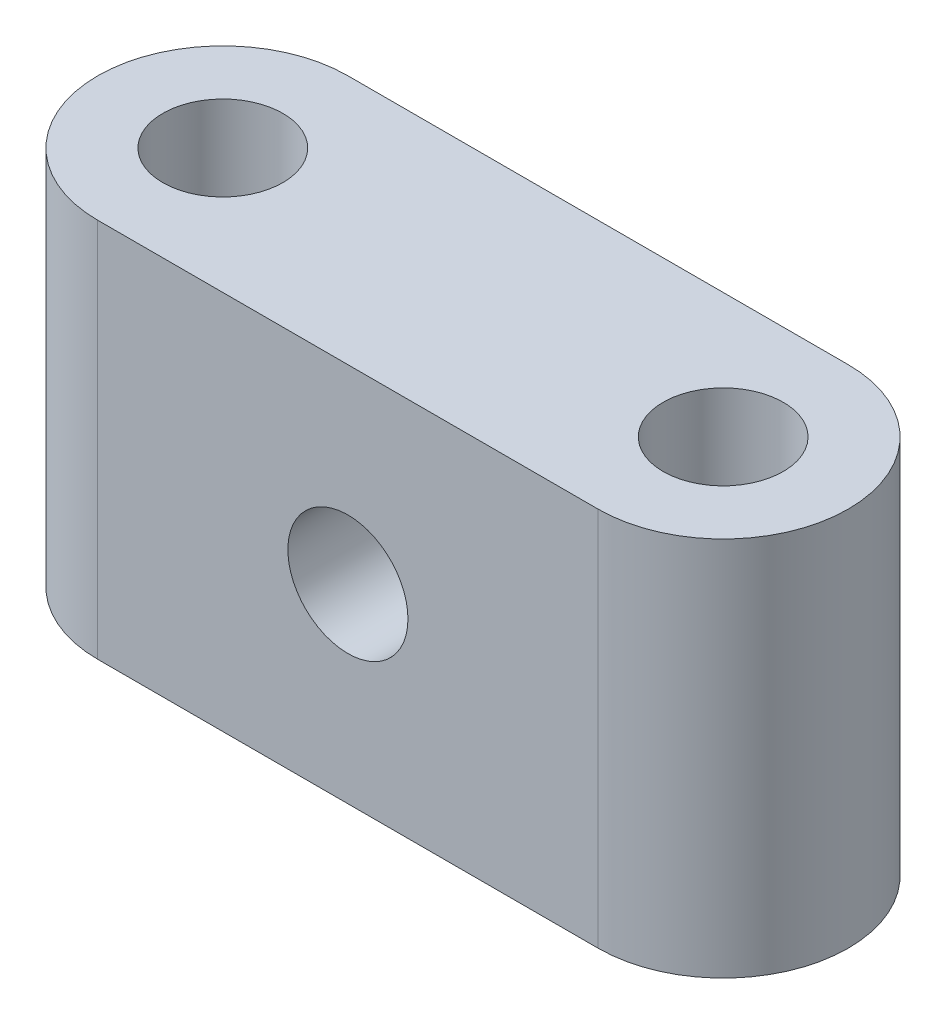
ISO-10303-21;
HEADER;
FILE_DESCRIPTION(('STEP AP214'),'2;1');
FILE_NAME('part.step','',(''),(''),'','','');
FILE_SCHEMA(('AUTOMOTIVE_DESIGN { 1 0 10303 214 1 1 1 1 }'));
ENDSEC;
DATA;
#1=APPLICATION_CONTEXT('core data for automotive mechanical design processes');
#2=APPLICATION_PROTOCOL_DEFINITION('international standard','automotive_design',2000,#1);
#3=PRODUCT_CONTEXT('',#1,'mechanical');
#4=PRODUCT('Part','Part','',(#3));
#5=PRODUCT_RELATED_PRODUCT_CATEGORY('part','',(#4));
#6=PRODUCT_DEFINITION_FORMATION('','',#4);
#7=PRODUCT_DEFINITION_CONTEXT('part definition',#1,'design');
#8=PRODUCT_DEFINITION('design','',#6,#7);
#9=PRODUCT_DEFINITION_SHAPE('','',#8);
#10=(LENGTH_UNIT() NAMED_UNIT(*) SI_UNIT(.MILLI.,.METRE.));
#11=(NAMED_UNIT(*) PLANE_ANGLE_UNIT() SI_UNIT($,.RADIAN.));
#12=(NAMED_UNIT(*) SI_UNIT($,.STERADIAN.) SOLID_ANGLE_UNIT());
#13=UNCERTAINTY_MEASURE_WITH_UNIT(LENGTH_MEASURE(1.E-05),#10,'distance_accuracy_value','');
#14=(GEOMETRIC_REPRESENTATION_CONTEXT(3) GLOBAL_UNCERTAINTY_ASSIGNED_CONTEXT((#13)) GLOBAL_UNIT_ASSIGNED_CONTEXT((#10,
#11,#12)) REPRESENTATION_CONTEXT('',''));
#15=CARTESIAN_POINT('',(0.,0.,0.));
#16=DIRECTION('',(0.,0.,1.));
#17=DIRECTION('',(1.,0.,0.));
#18=AXIS2_PLACEMENT_3D('',#15,#16,#17);
#19=CARTESIAN_POINT('',(-25.,19.,0.));
#20=DIRECTION('',(0.,1.,0.));
#21=DIRECTION('',(0.,0.,1.));
#22=AXIS2_PLACEMENT_3D('',#19,#20,#21);
#23=PLANE('',#22);
#24=CARTESIAN_POINT('',(-25.,19.,0.));
#25=DIRECTION('',(0.,1.,0.));
#26=DIRECTION('',(0.,0.,1.));
#27=AXIS2_PLACEMENT_3D('',#24,#25,#26);
#28=CIRCLE('',#27,6.);
#29=CARTESIAN_POINT('',(-25.,19.,6.));
#30=VERTEX_POINT('',#29);
#31=EDGE_CURVE('E100',#30,#30,#28,.T.);
#32=ORIENTED_EDGE('',*,*,#31,.F.);
#33=EDGE_LOOP('',(#32));
#34=FACE_BOUND('',#33,.T.);
#35=CARTESIAN_POINT('',(-25.,19.,0.));
#36=DIRECTION('',(0.,1.,0.));
#37=DIRECTION('',(0.,0.,1.));
#38=AXIS2_PLACEMENT_3D('',#35,#36,#37);
#39=CIRCLE('',#38,12.5);
#40=CARTESIAN_POINT('',(-25.,19.,-12.5));
#41=VERTEX_POINT('',#40);
#42=CARTESIAN_POINT('',(-25.,19.,12.5));
#43=VERTEX_POINT('',#42);
#44=EDGE_CURVE('E85',#41,#43,#39,.T.);
#45=ORIENTED_EDGE('',*,*,#44,.T.);
#46=DIRECTION('',(1.,0.,0.));
#47=VECTOR('',#46,1.);
#48=CARTESIAN_POINT('',(-25.,19.,12.5));
#49=LINE('',#48,#47);
#50=CARTESIAN_POINT('',(25.,19.,12.5));
#51=VERTEX_POINT('',#50);
#52=EDGE_CURVE('E80',#43,#51,#49,.T.);
#53=ORIENTED_EDGE('',*,*,#52,.T.);
#54=CARTESIAN_POINT('',(25.,19.,0.));
#55=DIRECTION('',(0.,1.,0.));
#56=DIRECTION('',(0.,0.,1.));
#57=AXIS2_PLACEMENT_3D('',#54,#55,#56);
#58=CIRCLE('',#57,12.5);
#59=CARTESIAN_POINT('',(25.,19.,-12.5));
#60=VERTEX_POINT('',#59);
#61=EDGE_CURVE('E83',#51,#60,#58,.T.);
#62=ORIENTED_EDGE('',*,*,#61,.T.);
#63=DIRECTION('',(-1.,0.,0.));
#64=VECTOR('',#63,1.);
#65=CARTESIAN_POINT('',(-25.,19.,-12.5));
#66=LINE('',#65,#64);
#67=EDGE_CURVE('E50',#60,#41,#66,.T.);
#68=ORIENTED_EDGE('',*,*,#67,.T.);
#69=EDGE_LOOP('',(#45,#53,#62,#68));
#70=FACE_BOUND('',#69,.T.);
#71=CARTESIAN_POINT('',(25.,19.,0.));
#72=DIRECTION('',(0.,1.,0.));
#73=DIRECTION('',(0.,0.,1.));
#74=AXIS2_PLACEMENT_3D('',#71,#72,#73);
#75=CIRCLE('',#74,6.);
#76=CARTESIAN_POINT('',(25.,19.,6.));
#77=VERTEX_POINT('',#76);
#78=EDGE_CURVE('E115',#77,#77,#75,.T.);
#79=ORIENTED_EDGE('',*,*,#78,.F.);
#80=EDGE_LOOP('',(#79));
#81=FACE_BOUND('',#80,.T.);
#82=ADVANCED_FACE('F33',(#34,#70,#81),#23,.T.);
#83=CARTESIAN_POINT('',(-25.,-19.,0.));
#84=DIRECTION('',(0.,1.,0.));
#85=DIRECTION('',(0.,0.,1.));
#86=AXIS2_PLACEMENT_3D('',#83,#84,#85);
#87=PLANE('',#86);
#88=CARTESIAN_POINT('',(-25.,-19.,0.));
#89=DIRECTION('',(0.,1.,0.));
#90=DIRECTION('',(0.,0.,1.));
#91=AXIS2_PLACEMENT_3D('',#88,#89,#90);
#92=CIRCLE('',#91,12.5);
#93=CARTESIAN_POINT('',(-25.,-19.,-12.5));
#94=VERTEX_POINT('',#93);
#95=CARTESIAN_POINT('',(-25.,-19.,12.5));
#96=VERTEX_POINT('',#95);
#97=EDGE_CURVE('E97',#94,#96,#92,.T.);
#98=ORIENTED_EDGE('',*,*,#97,.F.);
#99=DIRECTION('',(-1.,0.,0.));
#100=VECTOR('',#99,1.);
#101=CARTESIAN_POINT('',(-25.,-19.,-12.5));
#102=LINE('',#101,#100);
#103=CARTESIAN_POINT('',(25.,-19.,-12.5));
#104=VERTEX_POINT('',#103);
#105=EDGE_CURVE('E73',#104,#94,#102,.T.);
#106=ORIENTED_EDGE('',*,*,#105,.F.);
#107=CARTESIAN_POINT('',(25.,-19.,0.));
#108=DIRECTION('',(0.,1.,0.));
#109=DIRECTION('',(0.,0.,1.));
#110=AXIS2_PLACEMENT_3D('',#107,#108,#109);
#111=CIRCLE('',#110,12.5);
#112=CARTESIAN_POINT('',(25.,-19.,12.5));
#113=VERTEX_POINT('',#112);
#114=EDGE_CURVE('E67',#113,#104,#111,.T.);
#115=ORIENTED_EDGE('',*,*,#114,.F.);
#116=DIRECTION('',(1.,0.,0.));
#117=VECTOR('',#116,1.);
#118=CARTESIAN_POINT('',(-25.,-19.,12.5));
#119=LINE('',#118,#117);
#120=EDGE_CURVE('E89',#96,#113,#119,.T.);
#121=ORIENTED_EDGE('',*,*,#120,.F.);
#122=EDGE_LOOP('',(#98,#106,#115,#121));
#123=FACE_BOUND('',#122,.T.);
#124=CARTESIAN_POINT('',(-25.,-19.,0.));
#125=DIRECTION('',(0.,1.,0.));
#126=DIRECTION('',(0.,0.,1.));
#127=AXIS2_PLACEMENT_3D('',#124,#125,#126);
#128=CIRCLE('',#127,6.);
#129=CARTESIAN_POINT('',(-25.,-19.,6.));
#130=VERTEX_POINT('',#129);
#131=EDGE_CURVE('E112',#130,#130,#128,.T.);
#132=ORIENTED_EDGE('',*,*,#131,.T.);
#133=EDGE_LOOP('',(#132));
#134=FACE_BOUND('',#133,.T.);
#135=CARTESIAN_POINT('',(25.,-19.,0.));
#136=DIRECTION('',(0.,1.,0.));
#137=DIRECTION('',(0.,0.,1.));
#138=AXIS2_PLACEMENT_3D('',#135,#136,#137);
#139=CIRCLE('',#138,6.);
#140=CARTESIAN_POINT('',(25.,-19.,6.));
#141=VERTEX_POINT('',#140);
#142=EDGE_CURVE('E118',#141,#141,#139,.T.);
#143=ORIENTED_EDGE('',*,*,#142,.T.);
#144=EDGE_LOOP('',(#143));
#145=FACE_BOUND('',#144,.T.);
#146=ADVANCED_FACE('F108',(#123,#134,#145),#87,.F.);
#147=CARTESIAN_POINT('',(-25.,19.,0.));
#148=DIRECTION('',(0.,-1.,0.));
#149=DIRECTION('',(0.,0.,-1.));
#150=AXIS2_PLACEMENT_3D('',#147,#148,#149);
#151=CYLINDRICAL_SURFACE('',#150,12.5);
#152=ORIENTED_EDGE('',*,*,#97,.T.);
#153=DIRECTION('',(0.,-1.,0.));
#154=VECTOR('',#153,1.);
#155=CARTESIAN_POINT('',(-25.,19.,12.5));
#156=LINE('',#155,#154);
#157=EDGE_CURVE('E11',#43,#96,#156,.T.);
#158=ORIENTED_EDGE('',*,*,#157,.F.);
#159=ORIENTED_EDGE('',*,*,#44,.F.);
#160=DIRECTION('',(0.,-1.,0.));
#161=VECTOR('',#160,1.);
#162=CARTESIAN_POINT('',(-25.,19.,-12.5));
#163=LINE('',#162,#161);
#164=EDGE_CURVE('E93',#41,#94,#163,.T.);
#165=ORIENTED_EDGE('',*,*,#164,.T.);
#166=EDGE_LOOP('',(#152,#158,#159,#165));
#167=FACE_BOUND('',#166,.T.);
#168=ADVANCED_FACE('F35',(#167),#151,.T.);
#169=CARTESIAN_POINT('',(-25.,19.,12.5));
#170=DIRECTION('',(0.,0.,-1.));
#171=DIRECTION('',(-1.,0.,0.));
#172=AXIS2_PLACEMENT_3D('',#169,#170,#171);
#173=PLANE('',#172);
#174=CARTESIAN_POINT('',(0.,0.,12.5));
#175=DIRECTION('',(0.,0.,1.));
#176=DIRECTION('',(1.,0.,0.));
#177=AXIS2_PLACEMENT_3D('',#174,#175,#176);
#178=CIRCLE('',#177,6.);
#179=CARTESIAN_POINT('',(6.,0.,12.5));
#180=VERTEX_POINT('',#179);
#181=EDGE_CURVE('E124',#180,#180,#178,.T.);
#182=ORIENTED_EDGE('',*,*,#181,.F.);
#183=EDGE_LOOP('',(#182));
#184=FACE_BOUND('',#183,.T.);
#185=ORIENTED_EDGE('',*,*,#120,.T.);
#186=DIRECTION('',(0.,-1.,0.));
#187=VECTOR('',#186,1.);
#188=CARTESIAN_POINT('',(25.,19.,12.5));
#189=LINE('',#188,#187);
#190=EDGE_CURVE('E42',#51,#113,#189,.T.);
#191=ORIENTED_EDGE('',*,*,#190,.F.);
#192=ORIENTED_EDGE('',*,*,#52,.F.);
#193=ORIENTED_EDGE('',*,*,#157,.T.);
#194=EDGE_LOOP('',(#185,#191,#192,#193));
#195=FACE_BOUND('',#194,.T.);
#196=ADVANCED_FACE('F88',(#184,#195),#173,.F.);
#197=CARTESIAN_POINT('',(25.,19.,0.));
#198=DIRECTION('',(0.,-1.,0.));
#199=DIRECTION('',(0.,0.,-1.));
#200=AXIS2_PLACEMENT_3D('',#197,#198,#199);
#201=CYLINDRICAL_SURFACE('',#200,12.5);
#202=ORIENTED_EDGE('',*,*,#114,.T.);
#203=DIRECTION('',(0.,-1.,0.));
#204=VECTOR('',#203,1.);
#205=CARTESIAN_POINT('',(25.,19.,-12.5));
#206=LINE('',#205,#204);
#207=EDGE_CURVE('E90',#60,#104,#206,.T.);
#208=ORIENTED_EDGE('',*,*,#207,.F.);
#209=ORIENTED_EDGE('',*,*,#61,.F.);
#210=ORIENTED_EDGE('',*,*,#190,.T.);
#211=EDGE_LOOP('',(#202,#208,#209,#210));
#212=FACE_BOUND('',#211,.T.);
#213=ADVANCED_FACE('F91',(#212),#201,.T.);
#214=CARTESIAN_POINT('',(-25.,19.,-12.5));
#215=DIRECTION('',(0.,0.,1.));
#216=DIRECTION('',(1.,0.,0.));
#217=AXIS2_PLACEMENT_3D('',#214,#215,#216);
#218=PLANE('',#217);
#219=ORIENTED_EDGE('',*,*,#105,.T.);
#220=ORIENTED_EDGE('',*,*,#164,.F.);
#221=ORIENTED_EDGE('',*,*,#67,.F.);
#222=ORIENTED_EDGE('',*,*,#207,.T.);
#223=EDGE_LOOP('',(#219,#220,#221,#222));
#224=FACE_BOUND('',#223,.T.);
#225=ADVANCED_FACE('F105',(#224),#218,.F.);
#226=CARTESIAN_POINT('',(-25.,19.,0.));
#227=DIRECTION('',(0.,-1.,0.));
#228=DIRECTION('',(0.,0.,-1.));
#229=AXIS2_PLACEMENT_3D('',#226,#227,#228);
#230=CYLINDRICAL_SURFACE('',#229,6.);
#231=ORIENTED_EDGE('',*,*,#31,.T.);
#232=EDGE_LOOP('',(#231));
#233=FACE_BOUND('',#232,.T.);
#234=ORIENTED_EDGE('',*,*,#131,.F.);
#235=EDGE_LOOP('',(#234));
#236=FACE_BOUND('',#235,.T.);
#237=ADVANCED_FACE('F154',(#233,#236),#230,.F.);
#238=CARTESIAN_POINT('',(25.,19.,0.));
#239=DIRECTION('',(0.,-1.,0.));
#240=DIRECTION('',(0.,0.,-1.));
#241=AXIS2_PLACEMENT_3D('',#238,#239,#240);
#242=CYLINDRICAL_SURFACE('',#241,6.);
#243=ORIENTED_EDGE('',*,*,#78,.T.);
#244=EDGE_LOOP('',(#243));
#245=FACE_BOUND('',#244,.T.);
#246=ORIENTED_EDGE('',*,*,#142,.F.);
#247=EDGE_LOOP('',(#246));
#248=FACE_BOUND('',#247,.T.);
#249=ADVANCED_FACE('F135',(#245,#248),#242,.F.);
#250=CARTESIAN_POINT('',(0.,0.,0.5));
#251=DIRECTION('',(0.,0.,1.));
#252=DIRECTION('',(1.,0.,0.));
#253=AXIS2_PLACEMENT_3D('',#250,#251,#252);
#254=CYLINDRICAL_SURFACE('',#253,6.);
#255=CARTESIAN_POINT('',(0.,0.,0.5));
#256=DIRECTION('',(0.,0.,1.));
#257=DIRECTION('',(1.,0.,0.));
#258=AXIS2_PLACEMENT_3D('',#255,#256,#257);
#259=CIRCLE('',#258,6.);
#260=CARTESIAN_POINT('',(6.,0.,0.5));
#261=VERTEX_POINT('',#260);
#262=EDGE_CURVE('E121',#261,#261,#259,.T.);
#263=ORIENTED_EDGE('',*,*,#262,.F.);
#264=EDGE_LOOP('',(#263));
#265=FACE_BOUND('',#264,.T.);
#266=ORIENTED_EDGE('',*,*,#181,.T.);
#267=EDGE_LOOP('',(#266));
#268=FACE_BOUND('',#267,.T.);
#269=ADVANCED_FACE('F132',(#265,#268),#254,.F.);
#270=CARTESIAN_POINT('',(0.,0.,0.5));
#271=DIRECTION('',(0.,0.,1.));
#272=DIRECTION('',(1.,0.,0.));
#273=AXIS2_PLACEMENT_3D('',#270,#271,#272);
#274=PLANE('',#273);
#275=ORIENTED_EDGE('',*,*,#262,.T.);
#276=EDGE_LOOP('',(#275));
#277=FACE_BOUND('',#276,.T.);
#278=ADVANCED_FACE('F130',(#277),#274,.T.);
#279=CLOSED_SHELL('',(#82,#146,#168,#196,#213,#225,#237,#249,#269,#278));
#280=MANIFOLD_SOLID_BREP('B2',#279);
#281=ADVANCED_BREP_SHAPE_REPRESENTATION('',(#18,#280),#14);
#282=SHAPE_DEFINITION_REPRESENTATION(#9,#281);
ENDSEC;
END-ISO-10303-21;
